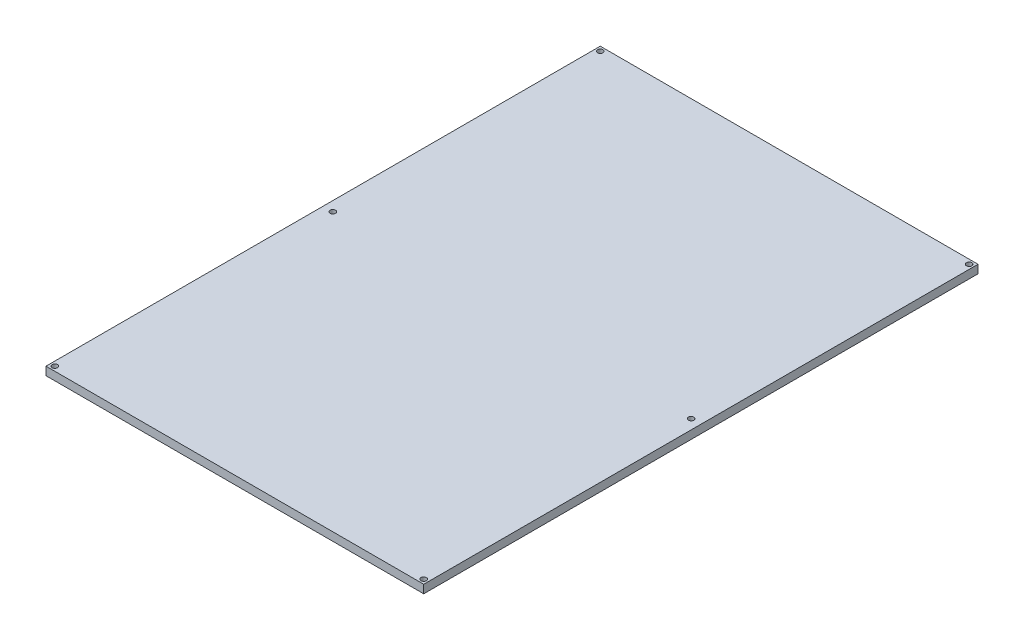
ISO-10303-21;
HEADER;
FILE_DESCRIPTION(('STEP AP214'),'2;1');
FILE_NAME('part.step','',(''),(''),'','','');
FILE_SCHEMA(('AUTOMOTIVE_DESIGN { 1 0 10303 214 1 1 1 1 }'));
ENDSEC;
DATA;
#1=APPLICATION_CONTEXT('core data for automotive mechanical design processes');
#2=APPLICATION_PROTOCOL_DEFINITION('international standard','automotive_design',2000,#1);
#3=PRODUCT_CONTEXT('',#1,'mechanical');
#4=PRODUCT('Part','Part','',(#3));
#5=PRODUCT_RELATED_PRODUCT_CATEGORY('part','',(#4));
#6=PRODUCT_DEFINITION_FORMATION('','',#4);
#7=PRODUCT_DEFINITION_CONTEXT('part definition',#1,'design');
#8=PRODUCT_DEFINITION('design','',#6,#7);
#9=PRODUCT_DEFINITION_SHAPE('','',#8);
#10=(LENGTH_UNIT() NAMED_UNIT(*) SI_UNIT(.MILLI.,.METRE.));
#11=(NAMED_UNIT(*) PLANE_ANGLE_UNIT() SI_UNIT($,.RADIAN.));
#12=(NAMED_UNIT(*) SI_UNIT($,.STERADIAN.) SOLID_ANGLE_UNIT());
#13=UNCERTAINTY_MEASURE_WITH_UNIT(LENGTH_MEASURE(1.E-05),#10,'distance_accuracy_value','');
#14=(GEOMETRIC_REPRESENTATION_CONTEXT(3) GLOBAL_UNCERTAINTY_ASSIGNED_CONTEXT((#13)) GLOBAL_UNIT_ASSIGNED_CONTEXT((#10,
#11,#12)) REPRESENTATION_CONTEXT('',''));
#15=CARTESIAN_POINT('',(0.,0.,0.));
#16=DIRECTION('',(0.,0.,1.));
#17=DIRECTION('',(1.,0.,0.));
#18=AXIS2_PLACEMENT_3D('',#15,#16,#17);
#19=CARTESIAN_POINT('',(0.,4.7,0.));
#20=DIRECTION('',(0.,-1.,0.));
#21=DIRECTION('',(0.,0.,-1.));
#22=AXIS2_PLACEMENT_3D('',#19,#20,#21);
#23=PLANE('',#22);
#24=DIRECTION('',(0.,0.,1.));
#25=VECTOR('',#24,1.);
#26=CARTESIAN_POINT('',(0.,4.7,0.));
#27=LINE('',#26,#25);
#28=CARTESIAN_POINT('',(-1.11022302462516E-13,4.7,-314.));
#29=VERTEX_POINT('',#28);
#30=CARTESIAN_POINT('',(0.,4.7,0.));
#31=VERTEX_POINT('',#30);
#32=EDGE_CURVE('E85',#29,#31,#27,.T.);
#33=ORIENTED_EDGE('',*,*,#32,.T.);
#34=DIRECTION('',(1.,0.,0.));
#35=VECTOR('',#34,1.);
#36=CARTESIAN_POINT('',(0.,4.7,0.));
#37=LINE('',#36,#35);
#38=CARTESIAN_POINT('',(214.,4.7,0.));
#39=VERTEX_POINT('',#38);
#40=EDGE_CURVE('E80',#31,#39,#37,.T.);
#41=ORIENTED_EDGE('',*,*,#40,.T.);
#42=DIRECTION('',(0.,0.,-1.));
#43=VECTOR('',#42,1.);
#44=CARTESIAN_POINT('',(214.,4.7,0.));
#45=LINE('',#44,#43);
#46=CARTESIAN_POINT('',(214.,4.7,-314.));
#47=VERTEX_POINT('',#46);
#48=EDGE_CURVE('E83',#39,#47,#45,.T.);
#49=ORIENTED_EDGE('',*,*,#48,.T.);
#50=DIRECTION('',(-1.,0.,0.));
#51=VECTOR('',#50,1.);
#52=CARTESIAN_POINT('',(-1.11022302462516E-13,4.7,-314.));
#53=LINE('',#52,#51);
#54=EDGE_CURVE('E50',#47,#29,#53,.T.);
#55=ORIENTED_EDGE('',*,*,#54,.T.);
#56=EDGE_LOOP('',(#33,#41,#49,#55));
#57=FACE_BOUND('',#56,.T.);
#58=CARTESIAN_POINT('',(2.5,4.7,-311.5));
#59=DIRECTION('',(0.,1.,0.));
#60=DIRECTION('',(0.,0.,1.));
#61=AXIS2_PLACEMENT_3D('',#58,#59,#60);
#62=CIRCLE('',#61,1.55000000000003);
#63=CARTESIAN_POINT('',(2.5,4.7,-309.95));
#64=VERTEX_POINT('',#63);
#65=EDGE_CURVE('E100',#64,#64,#62,.T.);
#66=ORIENTED_EDGE('',*,*,#65,.F.);
#67=EDGE_LOOP('',(#66));
#68=FACE_BOUND('',#67,.T.);
#69=CARTESIAN_POINT('',(211.5,4.7,-311.5));
#70=DIRECTION('',(0.,1.,0.));
#71=DIRECTION('',(0.,0.,-1.));
#72=AXIS2_PLACEMENT_3D('',#69,#70,#71);
#73=CIRCLE('',#72,1.55);
#74=CARTESIAN_POINT('',(211.5,4.7,-313.05));
#75=VERTEX_POINT('',#74);
#76=EDGE_CURVE('E115',#75,#75,#73,.T.);
#77=ORIENTED_EDGE('',*,*,#76,.F.);
#78=EDGE_LOOP('',(#77));
#79=FACE_BOUND('',#78,.T.);
#80=CARTESIAN_POINT('',(2.50000000000009,4.7,-2.49999999999998));
#81=DIRECTION('',(0.,1.,0.));
#82=DIRECTION('',(0.,0.,-1.));
#83=AXIS2_PLACEMENT_3D('',#80,#81,#82);
#84=CIRCLE('',#83,1.55000000000001);
#85=CARTESIAN_POINT('',(2.50000000000009,4.7,-4.04999999999998));
#86=VERTEX_POINT('',#85);
#87=EDGE_CURVE('E121',#86,#86,#84,.T.);
#88=ORIENTED_EDGE('',*,*,#87,.F.);
#89=EDGE_LOOP('',(#88));
#90=FACE_BOUND('',#89,.T.);
#91=CARTESIAN_POINT('',(211.5,4.7,-2.5));
#92=DIRECTION('',(0.,1.,0.));
#93=DIRECTION('',(0.,0.,1.));
#94=AXIS2_PLACEMENT_3D('',#91,#92,#93);
#95=CIRCLE('',#94,1.54999999999999);
#96=CARTESIAN_POINT('',(211.5,4.7,-0.950000000000008));
#97=VERTEX_POINT('',#96);
#98=EDGE_CURVE('E127',#97,#97,#95,.T.);
#99=ORIENTED_EDGE('',*,*,#98,.F.);
#100=EDGE_LOOP('',(#99));
#101=FACE_BOUND('',#100,.T.);
#102=CARTESIAN_POINT('',(5.50000000000003,4.7,-157.));
#103=DIRECTION('',(0.,1.,0.));
#104=DIRECTION('',(0.,0.,1.));
#105=AXIS2_PLACEMENT_3D('',#102,#103,#104);
#106=CIRCLE('',#105,1.55);
#107=CARTESIAN_POINT('',(5.50000000000003,4.7,-155.45));
#108=VERTEX_POINT('',#107);
#109=EDGE_CURVE('E133',#108,#108,#106,.T.);
#110=ORIENTED_EDGE('',*,*,#109,.F.);
#111=EDGE_LOOP('',(#110));
#112=FACE_BOUND('',#111,.T.);
#113=CARTESIAN_POINT('',(208.5,4.7,-157.));
#114=DIRECTION('',(0.,1.,0.));
#115=DIRECTION('',(0.,0.,-1.));
#116=AXIS2_PLACEMENT_3D('',#113,#114,#115);
#117=CIRCLE('',#116,1.54999999999999);
#118=CARTESIAN_POINT('',(208.5,4.7,-158.55));
#119=VERTEX_POINT('',#118);
#120=EDGE_CURVE('E139',#119,#119,#117,.T.);
#121=ORIENTED_EDGE('',*,*,#120,.F.);
#122=EDGE_LOOP('',(#121));
#123=FACE_BOUND('',#122,.T.);
#124=ADVANCED_FACE('F33',(#57,#68,#79,#90,#101,#112,#123),#23,.F.);
#125=CARTESIAN_POINT('',(0.,0.,0.));
#126=DIRECTION('',(0.,-1.,0.));
#127=DIRECTION('',(0.,0.,-1.));
#128=AXIS2_PLACEMENT_3D('',#125,#126,#127);
#129=PLANE('',#128);
#130=CARTESIAN_POINT('',(5.50000000000003,0.,-157.));
#131=DIRECTION('',(0.,1.,0.));
#132=DIRECTION('',(0.,0.,1.));
#133=AXIS2_PLACEMENT_3D('',#130,#131,#132);
#134=CIRCLE('',#133,1.55);
#135=CARTESIAN_POINT('',(5.50000000000003,0.,-155.45));
#136=VERTEX_POINT('',#135);
#137=EDGE_CURVE('E136',#136,#136,#134,.T.);
#138=ORIENTED_EDGE('',*,*,#137,.T.);
#139=EDGE_LOOP('',(#138));
#140=FACE_BOUND('',#139,.T.);
#141=CARTESIAN_POINT('',(2.50000000000009,0.,-2.49999999999998));
#142=DIRECTION('',(0.,1.,0.));
#143=DIRECTION('',(0.,0.,-1.));
#144=AXIS2_PLACEMENT_3D('',#141,#142,#143);
#145=CIRCLE('',#144,1.55000000000001);
#146=CARTESIAN_POINT('',(2.50000000000009,0.,-4.04999999999998));
#147=VERTEX_POINT('',#146);
#148=EDGE_CURVE('E124',#147,#147,#145,.T.);
#149=ORIENTED_EDGE('',*,*,#148,.T.);
#150=EDGE_LOOP('',(#149));
#151=FACE_BOUND('',#150,.T.);
#152=CARTESIAN_POINT('',(2.5,0.,-311.5));
#153=DIRECTION('',(0.,1.,0.));
#154=DIRECTION('',(0.,0.,1.));
#155=AXIS2_PLACEMENT_3D('',#152,#153,#154);
#156=CIRCLE('',#155,1.55000000000003);
#157=CARTESIAN_POINT('',(2.5,0.,-309.95));
#158=VERTEX_POINT('',#157);
#159=EDGE_CURVE('E112',#158,#158,#156,.T.);
#160=ORIENTED_EDGE('',*,*,#159,.T.);
#161=EDGE_LOOP('',(#160));
#162=FACE_BOUND('',#161,.T.);
#163=DIRECTION('',(0.,0.,1.));
#164=VECTOR('',#163,1.);
#165=CARTESIAN_POINT('',(0.,0.,0.));
#166=LINE('',#165,#164);
#167=CARTESIAN_POINT('',(-1.11022302462516E-13,0.,-314.));
#168=VERTEX_POINT('',#167);
#169=CARTESIAN_POINT('',(0.,0.,0.));
#170=VERTEX_POINT('',#169);
#171=EDGE_CURVE('E97',#168,#170,#166,.T.);
#172=ORIENTED_EDGE('',*,*,#171,.F.);
#173=DIRECTION('',(-1.,0.,0.));
#174=VECTOR('',#173,1.);
#175=CARTESIAN_POINT('',(-1.11022302462516E-13,0.,-314.));
#176=LINE('',#175,#174);
#177=CARTESIAN_POINT('',(214.,0.,-314.));
#178=VERTEX_POINT('',#177);
#179=EDGE_CURVE('E73',#178,#168,#176,.T.);
#180=ORIENTED_EDGE('',*,*,#179,.F.);
#181=DIRECTION('',(0.,0.,-1.));
#182=VECTOR('',#181,1.);
#183=CARTESIAN_POINT('',(214.,0.,0.));
#184=LINE('',#183,#182);
#185=CARTESIAN_POINT('',(214.,0.,0.));
#186=VERTEX_POINT('',#185);
#187=EDGE_CURVE('E67',#186,#178,#184,.T.);
#188=ORIENTED_EDGE('',*,*,#187,.F.);
#189=DIRECTION('',(1.,0.,0.));
#190=VECTOR('',#189,1.);
#191=CARTESIAN_POINT('',(0.,0.,0.));
#192=LINE('',#191,#190);
#193=EDGE_CURVE('E89',#170,#186,#192,.T.);
#194=ORIENTED_EDGE('',*,*,#193,.F.);
#195=EDGE_LOOP('',(#172,#180,#188,#194));
#196=FACE_BOUND('',#195,.T.);
#197=CARTESIAN_POINT('',(211.5,0.,-311.5));
#198=DIRECTION('',(0.,1.,0.));
#199=DIRECTION('',(0.,0.,-1.));
#200=AXIS2_PLACEMENT_3D('',#197,#198,#199);
#201=CIRCLE('',#200,1.55);
#202=CARTESIAN_POINT('',(211.5,0.,-313.05));
#203=VERTEX_POINT('',#202);
#204=EDGE_CURVE('E118',#203,#203,#201,.T.);
#205=ORIENTED_EDGE('',*,*,#204,.T.);
#206=EDGE_LOOP('',(#205));
#207=FACE_BOUND('',#206,.T.);
#208=CARTESIAN_POINT('',(211.5,0.,-2.5));
#209=DIRECTION('',(0.,1.,0.));
#210=DIRECTION('',(0.,0.,1.));
#211=AXIS2_PLACEMENT_3D('',#208,#209,#210);
#212=CIRCLE('',#211,1.54999999999999);
#213=CARTESIAN_POINT('',(211.5,0.,-0.950000000000008));
#214=VERTEX_POINT('',#213);
#215=EDGE_CURVE('E130',#214,#214,#212,.T.);
#216=ORIENTED_EDGE('',*,*,#215,.T.);
#217=EDGE_LOOP('',(#216));
#218=FACE_BOUND('',#217,.T.);
#219=CARTESIAN_POINT('',(208.5,0.,-157.));
#220=DIRECTION('',(0.,1.,0.));
#221=DIRECTION('',(0.,0.,-1.));
#222=AXIS2_PLACEMENT_3D('',#219,#220,#221);
#223=CIRCLE('',#222,1.54999999999999);
#224=CARTESIAN_POINT('',(208.5,0.,-158.55));
#225=VERTEX_POINT('',#224);
#226=EDGE_CURVE('E142',#225,#225,#223,.T.);
#227=ORIENTED_EDGE('',*,*,#226,.T.);
#228=EDGE_LOOP('',(#227));
#229=FACE_BOUND('',#228,.T.);
#230=ADVANCED_FACE('F108',(#140,#151,#162,#196,#207,#218,#229),#129,.T.);
#231=CARTESIAN_POINT('',(0.,4.7,0.));
#232=DIRECTION('',(1.,0.,0.));
#233=DIRECTION('',(0.,0.,-1.));
#234=AXIS2_PLACEMENT_3D('',#231,#232,#233);
#235=PLANE('',#234);
#236=ORIENTED_EDGE('',*,*,#171,.T.);
#237=DIRECTION('',(0.,-1.,0.));
#238=VECTOR('',#237,1.);
#239=CARTESIAN_POINT('',(0.,4.7,0.));
#240=LINE('',#239,#238);
#241=EDGE_CURVE('E11',#31,#170,#240,.T.);
#242=ORIENTED_EDGE('',*,*,#241,.F.);
#243=ORIENTED_EDGE('',*,*,#32,.F.);
#244=DIRECTION('',(0.,-1.,0.));
#245=VECTOR('',#244,1.);
#246=CARTESIAN_POINT('',(-1.11022302462516E-13,4.7,-314.));
#247=LINE('',#246,#245);
#248=EDGE_CURVE('E93',#29,#168,#247,.T.);
#249=ORIENTED_EDGE('',*,*,#248,.T.);
#250=EDGE_LOOP('',(#236,#242,#243,#249));
#251=FACE_BOUND('',#250,.T.);
#252=ADVANCED_FACE('F35',(#251),#235,.F.);
#253=CARTESIAN_POINT('',(0.,4.7,0.));
#254=DIRECTION('',(0.,0.,-1.));
#255=DIRECTION('',(-1.,0.,0.));
#256=AXIS2_PLACEMENT_3D('',#253,#254,#255);
#257=PLANE('',#256);
#258=ORIENTED_EDGE('',*,*,#193,.T.);
#259=DIRECTION('',(0.,-1.,0.));
#260=VECTOR('',#259,1.);
#261=CARTESIAN_POINT('',(214.,4.7,0.));
#262=LINE('',#261,#260);
#263=EDGE_CURVE('E42',#39,#186,#262,.T.);
#264=ORIENTED_EDGE('',*,*,#263,.F.);
#265=ORIENTED_EDGE('',*,*,#40,.F.);
#266=ORIENTED_EDGE('',*,*,#241,.T.);
#267=EDGE_LOOP('',(#258,#264,#265,#266));
#268=FACE_BOUND('',#267,.T.);
#269=ADVANCED_FACE('F88',(#268),#257,.F.);
#270=CARTESIAN_POINT('',(214.,4.7,0.));
#271=DIRECTION('',(-1.,0.,0.));
#272=DIRECTION('',(0.,0.,1.));
#273=AXIS2_PLACEMENT_3D('',#270,#271,#272);
#274=PLANE('',#273);
#275=ORIENTED_EDGE('',*,*,#187,.T.);
#276=DIRECTION('',(0.,-1.,0.));
#277=VECTOR('',#276,1.);
#278=CARTESIAN_POINT('',(214.,4.7,-314.));
#279=LINE('',#278,#277);
#280=EDGE_CURVE('E90',#47,#178,#279,.T.);
#281=ORIENTED_EDGE('',*,*,#280,.F.);
#282=ORIENTED_EDGE('',*,*,#48,.F.);
#283=ORIENTED_EDGE('',*,*,#263,.T.);
#284=EDGE_LOOP('',(#275,#281,#282,#283));
#285=FACE_BOUND('',#284,.T.);
#286=ADVANCED_FACE('F91',(#285),#274,.F.);
#287=CARTESIAN_POINT('',(-1.11022302462516E-13,4.7,-314.));
#288=DIRECTION('',(0.,0.,1.));
#289=DIRECTION('',(1.,0.,0.));
#290=AXIS2_PLACEMENT_3D('',#287,#288,#289);
#291=PLANE('',#290);
#292=ORIENTED_EDGE('',*,*,#179,.T.);
#293=ORIENTED_EDGE('',*,*,#248,.F.);
#294=ORIENTED_EDGE('',*,*,#54,.F.);
#295=ORIENTED_EDGE('',*,*,#280,.T.);
#296=EDGE_LOOP('',(#292,#293,#294,#295));
#297=FACE_BOUND('',#296,.T.);
#298=ADVANCED_FACE('F105',(#297),#291,.F.);
#299=CARTESIAN_POINT('',(2.5,4.7,-311.5));
#300=DIRECTION('',(0.,-1.,0.));
#301=DIRECTION('',(0.,0.,-1.));
#302=AXIS2_PLACEMENT_3D('',#299,#300,#301);
#303=CYLINDRICAL_SURFACE('',#302,1.55000000000003);
#304=ORIENTED_EDGE('',*,*,#65,.T.);
#305=EDGE_LOOP('',(#304));
#306=FACE_BOUND('',#305,.T.);
#307=ORIENTED_EDGE('',*,*,#159,.F.);
#308=EDGE_LOOP('',(#307));
#309=FACE_BOUND('',#308,.T.);
#310=ADVANCED_FACE('F159',(#306,#309),#303,.F.);
#311=CARTESIAN_POINT('',(211.5,4.7,-311.5));
#312=DIRECTION('',(0.,-1.,0.));
#313=DIRECTION('',(0.,0.,-1.));
#314=AXIS2_PLACEMENT_3D('',#311,#312,#313);
#315=CYLINDRICAL_SURFACE('',#314,1.55);
#316=ORIENTED_EDGE('',*,*,#76,.T.);
#317=EDGE_LOOP('',(#316));
#318=FACE_BOUND('',#317,.T.);
#319=ORIENTED_EDGE('',*,*,#204,.F.);
#320=EDGE_LOOP('',(#319));
#321=FACE_BOUND('',#320,.T.);
#322=ADVANCED_FACE('F205',(#318,#321),#315,.F.);
#323=CARTESIAN_POINT('',(2.50000000000009,4.7,-2.49999999999998));
#324=DIRECTION('',(0.,-1.,0.));
#325=DIRECTION('',(0.,0.,-1.));
#326=AXIS2_PLACEMENT_3D('',#323,#324,#325);
#327=CYLINDRICAL_SURFACE('',#326,1.55000000000001);
#328=ORIENTED_EDGE('',*,*,#87,.T.);
#329=EDGE_LOOP('',(#328));
#330=FACE_BOUND('',#329,.T.);
#331=ORIENTED_EDGE('',*,*,#148,.F.);
#332=EDGE_LOOP('',(#331));
#333=FACE_BOUND('',#332,.T.);
#334=ADVANCED_FACE('F213',(#330,#333),#327,.F.);
#335=CARTESIAN_POINT('',(211.5,4.7,-2.5));
#336=DIRECTION('',(0.,-1.,0.));
#337=DIRECTION('',(0.,0.,-1.));
#338=AXIS2_PLACEMENT_3D('',#335,#336,#337);
#339=CYLINDRICAL_SURFACE('',#338,1.54999999999999);
#340=ORIENTED_EDGE('',*,*,#98,.T.);
#341=EDGE_LOOP('',(#340));
#342=FACE_BOUND('',#341,.T.);
#343=ORIENTED_EDGE('',*,*,#215,.F.);
#344=EDGE_LOOP('',(#343));
#345=FACE_BOUND('',#344,.T.);
#346=ADVANCED_FACE('F221',(#342,#345),#339,.F.);
#347=CARTESIAN_POINT('',(5.50000000000003,4.7,-157.));
#348=DIRECTION('',(0.,-1.,0.));
#349=DIRECTION('',(0.,0.,-1.));
#350=AXIS2_PLACEMENT_3D('',#347,#348,#349);
#351=CYLINDRICAL_SURFACE('',#350,1.55);
#352=ORIENTED_EDGE('',*,*,#109,.T.);
#353=EDGE_LOOP('',(#352));
#354=FACE_BOUND('',#353,.T.);
#355=ORIENTED_EDGE('',*,*,#137,.F.);
#356=EDGE_LOOP('',(#355));
#357=FACE_BOUND('',#356,.T.);
#358=ADVANCED_FACE('F230',(#354,#357),#351,.F.);
#359=CARTESIAN_POINT('',(208.5,4.7,-157.));
#360=DIRECTION('',(0.,-1.,0.));
#361=DIRECTION('',(0.,0.,-1.));
#362=AXIS2_PLACEMENT_3D('',#359,#360,#361);
#363=CYLINDRICAL_SURFACE('',#362,1.54999999999999);
#364=ORIENTED_EDGE('',*,*,#120,.T.);
#365=EDGE_LOOP('',(#364));
#366=FACE_BOUND('',#365,.T.);
#367=ORIENTED_EDGE('',*,*,#226,.F.);
#368=EDGE_LOOP('',(#367));
#369=FACE_BOUND('',#368,.T.);
#370=ADVANCED_FACE('F148',(#366,#369),#363,.F.);
#371=CLOSED_SHELL('',(#124,#230,#252,#269,#286,#298,#310,#322,#334,#346,#358,#370));
#372=MANIFOLD_SOLID_BREP('B2',#371);
#373=ADVANCED_BREP_SHAPE_REPRESENTATION('',(#18,#372),#14);
#374=SHAPE_DEFINITION_REPRESENTATION(#9,#373);
ENDSEC;
END-ISO-10303-21;
